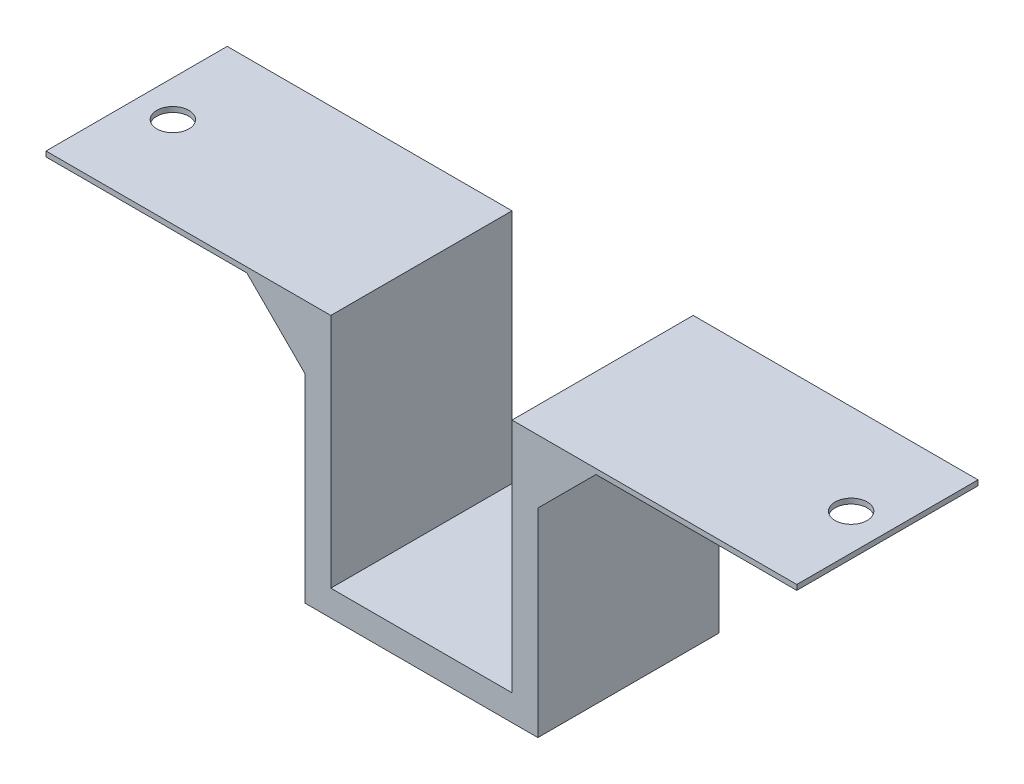
ISO-10303-21;
HEADER;
FILE_DESCRIPTION(('STEP AP214'),'2;1');
FILE_NAME('part.step','',(''),(''),'','','');
FILE_SCHEMA(('AUTOMOTIVE_DESIGN { 1 0 10303 214 1 1 1 1 }'));
ENDSEC;
DATA;
#1=APPLICATION_CONTEXT('core data for automotive mechanical design processes');
#2=APPLICATION_PROTOCOL_DEFINITION('international standard','automotive_design',2000,#1);
#3=PRODUCT_CONTEXT('',#1,'mechanical');
#4=PRODUCT('Part','Part','',(#3));
#5=PRODUCT_RELATED_PRODUCT_CATEGORY('part','',(#4));
#6=PRODUCT_DEFINITION_FORMATION('','',#4);
#7=PRODUCT_DEFINITION_CONTEXT('part definition',#1,'design');
#8=PRODUCT_DEFINITION('design','',#6,#7);
#9=PRODUCT_DEFINITION_SHAPE('','',#8);
#10=(LENGTH_UNIT() NAMED_UNIT(*) SI_UNIT(.MILLI.,.METRE.));
#11=(NAMED_UNIT(*) PLANE_ANGLE_UNIT() SI_UNIT($,.RADIAN.));
#12=(NAMED_UNIT(*) SI_UNIT($,.STERADIAN.) SOLID_ANGLE_UNIT());
#13=UNCERTAINTY_MEASURE_WITH_UNIT(LENGTH_MEASURE(1.E-05),#10,'distance_accuracy_value','');
#14=(GEOMETRIC_REPRESENTATION_CONTEXT(3) GLOBAL_UNCERTAINTY_ASSIGNED_CONTEXT((#13)) GLOBAL_UNIT_ASSIGNED_CONTEXT((#10,
#11,#12)) REPRESENTATION_CONTEXT('',''));
#15=CARTESIAN_POINT('',(0.,0.,0.));
#16=DIRECTION('',(0.,0.,1.));
#17=DIRECTION('',(1.,0.,0.));
#18=AXIS2_PLACEMENT_3D('',#15,#16,#17);
#19=CARTESIAN_POINT('',(-22.225,0.,44.45));
#20=DIRECTION('',(0.,1.,0.));
#21=DIRECTION('',(-1.,0.,0.));
#22=AXIS2_PLACEMENT_3D('',#19,#20,#21);
#23=PLANE('',#22);
#24=DIRECTION('',(1.,0.,0.));
#25=VECTOR('',#24,1.);
#26=CARTESIAN_POINT('',(-22.225,0.,0.));
#27=LINE('',#26,#25);
#28=CARTESIAN_POINT('',(-22.225,0.,0.));
#29=VERTEX_POINT('',#28);
#30=CARTESIAN_POINT('',(22.225,0.,0.));
#31=VERTEX_POINT('',#30);
#32=EDGE_CURVE('E189',#29,#31,#27,.T.);
#33=ORIENTED_EDGE('',*,*,#32,.F.);
#34=DIRECTION('',(0.,0.,-1.));
#35=VECTOR('',#34,1.);
#36=CARTESIAN_POINT('',(-22.225,0.,44.45));
#37=LINE('',#36,#35);
#38=CARTESIAN_POINT('',(-22.225,0.,44.45));
#39=VERTEX_POINT('',#38);
#40=EDGE_CURVE('E11',#39,#29,#37,.T.);
#41=ORIENTED_EDGE('',*,*,#40,.F.);
#42=DIRECTION('',(1.,0.,0.));
#43=VECTOR('',#42,1.);
#44=CARTESIAN_POINT('',(-22.225,0.,44.45));
#45=LINE('',#44,#43);
#46=CARTESIAN_POINT('',(22.225,0.,44.45));
#47=VERTEX_POINT('',#46);
#48=EDGE_CURVE('E239',#39,#47,#45,.T.);
#49=ORIENTED_EDGE('',*,*,#48,.T.);
#50=DIRECTION('',(0.,0.,-1.));
#51=VECTOR('',#50,1.);
#52=CARTESIAN_POINT('',(22.225,0.,44.45));
#53=LINE('',#52,#51);
#54=EDGE_CURVE('E50',#47,#31,#53,.T.);
#55=ORIENTED_EDGE('',*,*,#54,.T.);
#56=EDGE_LOOP('',(#33,#41,#49,#55));
#57=FACE_BOUND('',#56,.T.);
#58=ADVANCED_FACE('F47',(#57),#23,.T.);
#59=CARTESIAN_POINT('',(-22.225,0.,44.45));
#60=DIRECTION('',(-1.,0.,0.));
#61=DIRECTION('',(0.,0.,1.));
#62=AXIS2_PLACEMENT_3D('',#59,#60,#61);
#63=PLANE('',#62);
#64=DIRECTION('',(0.,1.,0.));
#65=VECTOR('',#64,1.);
#66=CARTESIAN_POINT('',(-22.225,0.,0.));
#67=LINE('',#66,#65);
#68=CARTESIAN_POINT('',(-22.225,57.9374,0.));
#69=VERTEX_POINT('',#68);
#70=EDGE_CURVE('E111',#29,#69,#67,.T.);
#71=ORIENTED_EDGE('',*,*,#70,.T.);
#72=DIRECTION('',(0.,0.,-1.));
#73=VECTOR('',#72,1.);
#74=CARTESIAN_POINT('',(-22.225,57.9374,44.45));
#75=LINE('',#74,#73);
#76=CARTESIAN_POINT('',(-22.225,57.9374,44.45));
#77=VERTEX_POINT('',#76);
#78=EDGE_CURVE('E57',#77,#69,#75,.T.);
#79=ORIENTED_EDGE('',*,*,#78,.F.);
#80=DIRECTION('',(0.,1.,0.));
#81=VECTOR('',#80,1.);
#82=CARTESIAN_POINT('',(-22.225,0.,44.45));
#83=LINE('',#82,#81);
#84=EDGE_CURVE('E160',#39,#77,#83,.T.);
#85=ORIENTED_EDGE('',*,*,#84,.F.);
#86=ORIENTED_EDGE('',*,*,#40,.T.);
#87=EDGE_LOOP('',(#71,#79,#85,#86));
#88=FACE_BOUND('',#87,.T.);
#89=ADVANCED_FACE('F390',(#88),#63,.F.);
#90=CARTESIAN_POINT('',(-22.225,57.9374,44.45));
#91=DIRECTION('',(0.,-1.,0.));
#92=DIRECTION('',(1.,0.,0.));
#93=AXIS2_PLACEMENT_3D('',#90,#91,#92);
#94=PLANE('',#93);
#95=CARTESIAN_POINT('',(-83.1849999999999,57.9374,22.225));
#96=DIRECTION('',(0.,-1.,0.));
#97=DIRECTION('',(-1.,0.,0.));
#98=AXIS2_PLACEMENT_3D('',#95,#96,#97);
#99=CIRCLE('',#98,3.937);
#100=CARTESIAN_POINT('',(-87.1219999999999,57.9374,22.225));
#101=VERTEX_POINT('',#100);
#102=EDGE_CURVE('E330',#101,#101,#99,.T.);
#103=ORIENTED_EDGE('',*,*,#102,.T.);
#104=EDGE_LOOP('',(#103));
#105=FACE_BOUND('',#104,.T.);
#106=DIRECTION('',(-1.,0.,0.));
#107=VECTOR('',#106,1.);
#108=CARTESIAN_POINT('',(-22.225,57.9374,0.));
#109=LINE('',#108,#107);
#110=CARTESIAN_POINT('',(-92.075,57.9374,0.));
#111=VERTEX_POINT('',#110);
#112=EDGE_CURVE('E168',#69,#111,#109,.T.);
#113=ORIENTED_EDGE('',*,*,#112,.T.);
#114=DIRECTION('',(0.,0.,-1.));
#115=VECTOR('',#114,1.);
#116=CARTESIAN_POINT('',(-92.075,57.9374,44.45));
#117=LINE('',#116,#115);
#118=CARTESIAN_POINT('',(-92.075,57.9374,44.45));
#119=VERTEX_POINT('',#118);
#120=EDGE_CURVE('E165',#119,#111,#117,.T.);
#121=ORIENTED_EDGE('',*,*,#120,.F.);
#122=DIRECTION('',(-1.,0.,0.));
#123=VECTOR('',#122,1.);
#124=CARTESIAN_POINT('',(-28.575,57.9374,44.45));
#125=LINE('',#124,#123);
#126=EDGE_CURVE('E153',#77,#119,#125,.T.);
#127=ORIENTED_EDGE('',*,*,#126,.F.);
#128=ORIENTED_EDGE('',*,*,#78,.T.);
#129=EDGE_LOOP('',(#113,#121,#127,#128));
#130=FACE_BOUND('',#129,.T.);
#131=ADVANCED_FACE('F166',(#105,#130),#94,.F.);
#132=CARTESIAN_POINT('',(-92.075,57.9374,44.45));
#133=DIRECTION('',(1.,0.,0.));
#134=DIRECTION('',(0.,0.,-1.));
#135=AXIS2_PLACEMENT_3D('',#132,#133,#134);
#136=PLANE('',#135);
#137=DIRECTION('',(0.,-1.,0.));
#138=VECTOR('',#137,1.);
#139=CARTESIAN_POINT('',(-92.075,57.9374,0.));
#140=LINE('',#139,#138);
#141=CARTESIAN_POINT('',(-92.075,56.6674,0.));
#142=VERTEX_POINT('',#141);
#143=EDGE_CURVE('E233',#111,#142,#140,.T.);
#144=ORIENTED_EDGE('',*,*,#143,.T.);
#145=DIRECTION('',(0.,0.,-1.));
#146=VECTOR('',#145,1.);
#147=CARTESIAN_POINT('',(-92.075,56.6674,44.45));
#148=LINE('',#147,#146);
#149=CARTESIAN_POINT('',(-92.075,56.6674,44.45));
#150=VERTEX_POINT('',#149);
#151=EDGE_CURVE('E172',#150,#142,#148,.T.);
#152=ORIENTED_EDGE('',*,*,#151,.F.);
#153=DIRECTION('',(0.,-1.,0.));
#154=VECTOR('',#153,1.);
#155=CARTESIAN_POINT('',(-92.075,57.9374,44.45));
#156=LINE('',#155,#154);
#157=EDGE_CURVE('E158',#119,#150,#156,.T.);
#158=ORIENTED_EDGE('',*,*,#157,.F.);
#159=ORIENTED_EDGE('',*,*,#120,.T.);
#160=EDGE_LOOP('',(#144,#152,#158,#159));
#161=FACE_BOUND('',#160,.T.);
#162=ADVANCED_FACE('F174',(#161),#136,.F.);
#163=CARTESIAN_POINT('',(-92.075,56.6674,44.45));
#164=DIRECTION('',(0.,1.,0.));
#165=DIRECTION('',(0.,0.,1.));
#166=AXIS2_PLACEMENT_3D('',#163,#164,#165);
#167=PLANE('',#166);
#168=CARTESIAN_POINT('',(-83.1849999999999,56.6674000000001,22.225));
#169=DIRECTION('',(0.,-1.,0.));
#170=DIRECTION('',(-1.,0.,0.));
#171=AXIS2_PLACEMENT_3D('',#168,#169,#170);
#172=CIRCLE('',#171,3.937);
#173=CARTESIAN_POINT('',(-87.1219999999999,56.6674000000001,22.225));
#174=VERTEX_POINT('',#173);
#175=EDGE_CURVE('E334',#174,#174,#172,.T.);
#176=ORIENTED_EDGE('',*,*,#175,.F.);
#177=EDGE_LOOP('',(#176));
#178=FACE_BOUND('',#177,.T.);
#179=DIRECTION('',(1.,0.,0.));
#180=VECTOR('',#179,1.);
#181=CARTESIAN_POINT('',(-92.075,56.6674,0.));
#182=LINE('',#181,#180);
#183=CARTESIAN_POINT('',(-42.8181414649475,56.6674,0.));
#184=VERTEX_POINT('',#183);
#185=EDGE_CURVE('E230',#142,#184,#182,.T.);
#186=ORIENTED_EDGE('',*,*,#185,.T.);
#187=DIRECTION('',(0.,0.,-1.));
#188=VECTOR('',#187,1.);
#189=CARTESIAN_POINT('',(-42.8181414649475,56.6674,44.45));
#190=LINE('',#189,#188);
#191=CARTESIAN_POINT('',(-42.8181414649475,56.6674,44.45));
#192=VERTEX_POINT('',#191);
#193=EDGE_CURVE('E245',#192,#184,#190,.T.);
#194=ORIENTED_EDGE('',*,*,#193,.F.);
#195=DIRECTION('',(1.,0.,0.));
#196=VECTOR('',#195,1.);
#197=CARTESIAN_POINT('',(-92.075,56.6674,44.45));
#198=LINE('',#197,#196);
#199=EDGE_CURVE('E178',#150,#192,#198,.T.);
#200=ORIENTED_EDGE('',*,*,#199,.F.);
#201=ORIENTED_EDGE('',*,*,#151,.T.);
#202=EDGE_LOOP('',(#186,#194,#200,#201));
#203=FACE_BOUND('',#202,.T.);
#204=ADVANCED_FACE('F283',(#178,#203),#167,.F.);
#205=CARTESIAN_POINT('',(-42.8181414649475,56.6674,44.45));
#206=DIRECTION('',(0.707106781186539,0.707106781186556,0.));
#207=DIRECTION('',(-0.707106781186556,0.707106781186539,0.));
#208=AXIS2_PLACEMENT_3D('',#205,#206,#207);
#209=PLANE('',#208);
#210=DIRECTION('',(0.707106781186556,-0.707106781186539,0.));
#211=VECTOR('',#210,1.);
#212=CARTESIAN_POINT('',(-42.8181414649475,56.6674,0.));
#213=LINE('',#212,#211);
#214=CARTESIAN_POINT('',(-28.575,42.4242585350528,0.));
#215=VERTEX_POINT('',#214);
#216=EDGE_CURVE('E226',#184,#215,#213,.T.);
#217=ORIENTED_EDGE('',*,*,#216,.T.);
#218=DIRECTION('',(0.,0.,-1.));
#219=VECTOR('',#218,1.);
#220=CARTESIAN_POINT('',(-28.575,42.4242585350528,44.45));
#221=LINE('',#220,#219);
#222=CARTESIAN_POINT('',(-28.575,42.4242585350528,44.45));
#223=VERTEX_POINT('',#222);
#224=EDGE_CURVE('E249',#223,#215,#221,.T.);
#225=ORIENTED_EDGE('',*,*,#224,.F.);
#226=DIRECTION('',(0.707106781186556,-0.707106781186539,0.));
#227=VECTOR('',#226,1.);
#228=CARTESIAN_POINT('',(-42.8181414649475,56.6674,44.45));
#229=LINE('',#228,#227);
#230=EDGE_CURVE('E183',#192,#223,#229,.T.);
#231=ORIENTED_EDGE('',*,*,#230,.F.);
#232=ORIENTED_EDGE('',*,*,#193,.T.);
#233=EDGE_LOOP('',(#217,#225,#231,#232));
#234=FACE_BOUND('',#233,.T.);
#235=ADVANCED_FACE('F294',(#234),#209,.F.);
#236=CARTESIAN_POINT('',(-28.575,-6.35000000000001,44.45));
#237=DIRECTION('',(-1.,0.,0.));
#238=DIRECTION('',(0.,-1.,0.));
#239=AXIS2_PLACEMENT_3D('',#236,#237,#238);
#240=PLANE('',#239);
#241=DIRECTION('',(0.,1.,0.));
#242=VECTOR('',#241,1.);
#243=CARTESIAN_POINT('',(-28.575,-6.35000000000001,0.));
#244=LINE('',#243,#242);
#245=CARTESIAN_POINT('',(-28.575,-6.35000000000001,0.));
#246=VERTEX_POINT('',#245);
#247=EDGE_CURVE('E222',#246,#215,#244,.T.);
#248=ORIENTED_EDGE('',*,*,#247,.F.);
#249=DIRECTION('',(0.,0.,-1.));
#250=VECTOR('',#249,1.);
#251=CARTESIAN_POINT('',(-28.575,-6.35000000000001,44.45));
#252=LINE('',#251,#250);
#253=CARTESIAN_POINT('',(-28.575,-6.35000000000001,44.45));
#254=VERTEX_POINT('',#253);
#255=EDGE_CURVE('E252',#254,#246,#252,.T.);
#256=ORIENTED_EDGE('',*,*,#255,.F.);
#257=DIRECTION('',(0.,1.,0.));
#258=VECTOR('',#257,1.);
#259=CARTESIAN_POINT('',(-28.575,-6.35000000000001,44.45));
#260=LINE('',#259,#258);
#261=EDGE_CURVE('E290',#254,#223,#260,.T.);
#262=ORIENTED_EDGE('',*,*,#261,.T.);
#263=ORIENTED_EDGE('',*,*,#224,.T.);
#264=EDGE_LOOP('',(#248,#256,#262,#263));
#265=FACE_BOUND('',#264,.T.);
#266=ADVANCED_FACE('F297',(#265),#240,.T.);
#267=CARTESIAN_POINT('',(28.575,-6.35,44.45));
#268=DIRECTION('',(0.,-1.,0.));
#269=DIRECTION('',(1.,0.,0.));
#270=AXIS2_PLACEMENT_3D('',#267,#268,#269);
#271=PLANE('',#270);
#272=DIRECTION('',(-1.,0.,0.));
#273=VECTOR('',#272,1.);
#274=CARTESIAN_POINT('',(28.575,-6.35,0.));
#275=LINE('',#274,#273);
#276=CARTESIAN_POINT('',(28.575,-6.35,0.));
#277=VERTEX_POINT('',#276);
#278=EDGE_CURVE('E218',#277,#246,#275,.T.);
#279=ORIENTED_EDGE('',*,*,#278,.F.);
#280=DIRECTION('',(0.,0.,-1.));
#281=VECTOR('',#280,1.);
#282=CARTESIAN_POINT('',(28.575,-6.35,44.45));
#283=LINE('',#282,#281);
#284=CARTESIAN_POINT('',(28.575,-6.35,44.45));
#285=VERTEX_POINT('',#284);
#286=EDGE_CURVE('E255',#285,#277,#283,.T.);
#287=ORIENTED_EDGE('',*,*,#286,.F.);
#288=DIRECTION('',(-1.,0.,0.));
#289=VECTOR('',#288,1.);
#290=CARTESIAN_POINT('',(28.575,-6.35,44.45));
#291=LINE('',#290,#289);
#292=EDGE_CURVE('E299',#285,#254,#291,.T.);
#293=ORIENTED_EDGE('',*,*,#292,.T.);
#294=ORIENTED_EDGE('',*,*,#255,.T.);
#295=EDGE_LOOP('',(#279,#287,#293,#294));
#296=FACE_BOUND('',#295,.T.);
#297=ADVANCED_FACE('F380',(#296),#271,.T.);
#298=CARTESIAN_POINT('',(28.5749999999999,42.4242585350529,44.45));
#299=DIRECTION('',(1.,0.,0.));
#300=DIRECTION('',(0.,1.,0.));
#301=AXIS2_PLACEMENT_3D('',#298,#299,#300);
#302=PLANE('',#301);
#303=DIRECTION('',(0.,-1.,0.));
#304=VECTOR('',#303,1.);
#305=CARTESIAN_POINT('',(28.5749999999999,42.4242585350529,0.));
#306=LINE('',#305,#304);
#307=CARTESIAN_POINT('',(28.5749999999999,42.4242585350529,0.));
#308=VERTEX_POINT('',#307);
#309=EDGE_CURVE('E214',#308,#277,#306,.T.);
#310=ORIENTED_EDGE('',*,*,#309,.F.);
#311=DIRECTION('',(0.,0.,-1.));
#312=VECTOR('',#311,1.);
#313=CARTESIAN_POINT('',(28.5749999999999,42.4242585350529,44.45));
#314=LINE('',#313,#312);
#315=CARTESIAN_POINT('',(28.5749999999999,42.4242585350529,44.45));
#316=VERTEX_POINT('',#315);
#317=EDGE_CURVE('E258',#316,#308,#314,.T.);
#318=ORIENTED_EDGE('',*,*,#317,.F.);
#319=DIRECTION('',(0.,-1.,0.));
#320=VECTOR('',#319,1.);
#321=CARTESIAN_POINT('',(28.5749999999999,42.4242585350529,44.45));
#322=LINE('',#321,#320);
#323=EDGE_CURVE('E304',#316,#285,#322,.T.);
#324=ORIENTED_EDGE('',*,*,#323,.T.);
#325=ORIENTED_EDGE('',*,*,#286,.T.);
#326=EDGE_LOOP('',(#310,#318,#324,#325));
#327=FACE_BOUND('',#326,.T.);
#328=ADVANCED_FACE('F378',(#327),#302,.T.);
#329=CARTESIAN_POINT('',(42.8181414649474,56.6674000000001,44.45));
#330=DIRECTION('',(0.707106781186541,-0.707106781186554,0.));
#331=DIRECTION('',(0.707106781186554,0.707106781186541,0.));
#332=AXIS2_PLACEMENT_3D('',#329,#330,#331);
#333=PLANE('',#332);
#334=DIRECTION('',(-0.707106781186554,-0.707106781186541,0.));
#335=VECTOR('',#334,1.);
#336=CARTESIAN_POINT('',(42.8181414649474,56.6674000000001,0.));
#337=LINE('',#336,#335);
#338=CARTESIAN_POINT('',(42.8181414649474,56.6674000000001,0.));
#339=VERTEX_POINT('',#338);
#340=EDGE_CURVE('E210',#339,#308,#337,.T.);
#341=ORIENTED_EDGE('',*,*,#340,.F.);
#342=DIRECTION('',(0.,0.,-1.));
#343=VECTOR('',#342,1.);
#344=CARTESIAN_POINT('',(42.8181414649474,56.6674000000001,44.45));
#345=LINE('',#344,#343);
#346=CARTESIAN_POINT('',(42.8181414649474,56.6674000000001,44.45));
#347=VERTEX_POINT('',#346);
#348=EDGE_CURVE('E261',#347,#339,#345,.T.);
#349=ORIENTED_EDGE('',*,*,#348,.F.);
#350=DIRECTION('',(-0.707106781186554,-0.707106781186541,0.));
#351=VECTOR('',#350,1.);
#352=CARTESIAN_POINT('',(42.8181414649474,56.6674000000001,44.45));
#353=LINE('',#352,#351);
#354=EDGE_CURVE('E310',#347,#316,#353,.T.);
#355=ORIENTED_EDGE('',*,*,#354,.T.);
#356=ORIENTED_EDGE('',*,*,#317,.T.);
#357=EDGE_LOOP('',(#341,#349,#355,#356));
#358=FACE_BOUND('',#357,.T.);
#359=ADVANCED_FACE('F362',(#358),#333,.T.);
#360=CARTESIAN_POINT('',(92.075,56.6674,44.45));
#361=DIRECTION('',(0.,-1.,0.));
#362=DIRECTION('',(1.,0.,0.));
#363=AXIS2_PLACEMENT_3D('',#360,#361,#362);
#364=PLANE('',#363);
#365=CARTESIAN_POINT('',(83.1850000000001,56.6674000000002,22.225));
#366=DIRECTION('',(0.,-1.,0.));
#367=DIRECTION('',(1.,0.,0.));
#368=AXIS2_PLACEMENT_3D('',#365,#366,#367);
#369=CIRCLE('',#368,3.937);
#370=CARTESIAN_POINT('',(87.1220000000001,56.6674000000002,22.225));
#371=VERTEX_POINT('',#370);
#372=EDGE_CURVE('E338',#371,#371,#369,.T.);
#373=ORIENTED_EDGE('',*,*,#372,.F.);
#374=EDGE_LOOP('',(#373));
#375=FACE_BOUND('',#374,.T.);
#376=DIRECTION('',(-1.,0.,0.));
#377=VECTOR('',#376,1.);
#378=CARTESIAN_POINT('',(92.075,56.6674,0.));
#379=LINE('',#378,#377);
#380=CARTESIAN_POINT('',(92.075,56.6674,0.));
#381=VERTEX_POINT('',#380);
#382=EDGE_CURVE('E206',#381,#339,#379,.T.);
#383=ORIENTED_EDGE('',*,*,#382,.F.);
#384=DIRECTION('',(0.,0.,-1.));
#385=VECTOR('',#384,1.);
#386=CARTESIAN_POINT('',(92.075,56.6674,44.45));
#387=LINE('',#386,#385);
#388=CARTESIAN_POINT('',(92.075,56.6674,44.45));
#389=VERTEX_POINT('',#388);
#390=EDGE_CURVE('E264',#389,#381,#387,.T.);
#391=ORIENTED_EDGE('',*,*,#390,.F.);
#392=DIRECTION('',(-1.,0.,0.));
#393=VECTOR('',#392,1.);
#394=CARTESIAN_POINT('',(92.075,56.6674,44.45));
#395=LINE('',#394,#393);
#396=EDGE_CURVE('E314',#389,#347,#395,.T.);
#397=ORIENTED_EDGE('',*,*,#396,.T.);
#398=ORIENTED_EDGE('',*,*,#348,.T.);
#399=EDGE_LOOP('',(#383,#391,#397,#398));
#400=FACE_BOUND('',#399,.T.);
#401=ADVANCED_FACE('F358',(#375,#400),#364,.T.);
#402=CARTESIAN_POINT('',(92.075,57.9374,44.45));
#403=DIRECTION('',(1.,0.,0.));
#404=DIRECTION('',(0.,0.,-1.));
#405=AXIS2_PLACEMENT_3D('',#402,#403,#404);
#406=PLANE('',#405);
#407=DIRECTION('',(0.,-1.,0.));
#408=VECTOR('',#407,1.);
#409=CARTESIAN_POINT('',(92.075,57.9374,0.));
#410=LINE('',#409,#408);
#411=CARTESIAN_POINT('',(92.075,57.9374,0.));
#412=VERTEX_POINT('',#411);
#413=EDGE_CURVE('E202',#412,#381,#410,.T.);
#414=ORIENTED_EDGE('',*,*,#413,.F.);
#415=DIRECTION('',(0.,0.,-1.));
#416=VECTOR('',#415,1.);
#417=CARTESIAN_POINT('',(92.075,57.9374,44.45));
#418=LINE('',#417,#416);
#419=CARTESIAN_POINT('',(92.075,57.9374,44.45));
#420=VERTEX_POINT('',#419);
#421=EDGE_CURVE('E267',#420,#412,#418,.T.);
#422=ORIENTED_EDGE('',*,*,#421,.F.);
#423=DIRECTION('',(0.,-1.,0.));
#424=VECTOR('',#423,1.);
#425=CARTESIAN_POINT('',(92.075,57.9374,44.45));
#426=LINE('',#425,#424);
#427=EDGE_CURVE('E318',#420,#389,#426,.T.);
#428=ORIENTED_EDGE('',*,*,#427,.T.);
#429=ORIENTED_EDGE('',*,*,#390,.T.);
#430=EDGE_LOOP('',(#414,#422,#428,#429));
#431=FACE_BOUND('',#430,.T.);
#432=ADVANCED_FACE('F361',(#431),#406,.T.);
#433=CARTESIAN_POINT('',(28.575,57.9374,44.45));
#434=DIRECTION('',(0.,1.,0.));
#435=DIRECTION('',(-1.,0.,0.));
#436=AXIS2_PLACEMENT_3D('',#433,#434,#435);
#437=PLANE('',#436);
#438=CARTESIAN_POINT('',(83.1850000000001,57.9374000000001,22.225));
#439=DIRECTION('',(0.,-1.,0.));
#440=DIRECTION('',(1.,0.,0.));
#441=AXIS2_PLACEMENT_3D('',#438,#439,#440);
#442=CIRCLE('',#441,3.937);
#443=CARTESIAN_POINT('',(87.1220000000001,57.9374000000001,22.225));
#444=VERTEX_POINT('',#443);
#445=EDGE_CURVE('E194',#444,#444,#442,.T.);
#446=ORIENTED_EDGE('',*,*,#445,.T.);
#447=EDGE_LOOP('',(#446));
#448=FACE_BOUND('',#447,.T.);
#449=DIRECTION('',(1.,0.,0.));
#450=VECTOR('',#449,1.);
#451=CARTESIAN_POINT('',(28.575,57.9374,0.));
#452=LINE('',#451,#450);
#453=CARTESIAN_POINT('',(22.225,57.9374,0.));
#454=VERTEX_POINT('',#453);
#455=EDGE_CURVE('E198',#454,#412,#452,.T.);
#456=ORIENTED_EDGE('',*,*,#455,.F.);
#457=DIRECTION('',(0.,0.,-1.));
#458=VECTOR('',#457,1.);
#459=CARTESIAN_POINT('',(22.225,57.9374,44.45));
#460=LINE('',#459,#458);
#461=CARTESIAN_POINT('',(22.225,57.9374,44.45));
#462=VERTEX_POINT('',#461);
#463=EDGE_CURVE('E269',#462,#454,#460,.T.);
#464=ORIENTED_EDGE('',*,*,#463,.F.);
#465=DIRECTION('',(1.,0.,0.));
#466=VECTOR('',#465,1.);
#467=CARTESIAN_POINT('',(22.225,57.9374,44.45));
#468=LINE('',#467,#466);
#469=EDGE_CURVE('E322',#462,#420,#468,.T.);
#470=ORIENTED_EDGE('',*,*,#469,.T.);
#471=ORIENTED_EDGE('',*,*,#421,.T.);
#472=EDGE_LOOP('',(#456,#464,#470,#471));
#473=FACE_BOUND('',#472,.T.);
#474=ADVANCED_FACE('F348',(#448,#473),#437,.T.);
#475=CARTESIAN_POINT('',(22.225,0.,44.45));
#476=DIRECTION('',(-1.,0.,0.));
#477=DIRECTION('',(0.,-1.,0.));
#478=AXIS2_PLACEMENT_3D('',#475,#476,#477);
#479=PLANE('',#478);
#480=DIRECTION('',(0.,1.,0.));
#481=VECTOR('',#480,1.);
#482=CARTESIAN_POINT('',(22.225,0.,0.));
#483=LINE('',#482,#481);
#484=EDGE_CURVE('E193',#31,#454,#483,.T.);
#485=ORIENTED_EDGE('',*,*,#484,.F.);
#486=ORIENTED_EDGE('',*,*,#54,.F.);
#487=DIRECTION('',(0.,1.,0.));
#488=VECTOR('',#487,1.);
#489=CARTESIAN_POINT('',(22.225,0.,44.45));
#490=LINE('',#489,#488);
#491=EDGE_CURVE('E325',#47,#462,#490,.T.);
#492=ORIENTED_EDGE('',*,*,#491,.T.);
#493=ORIENTED_EDGE('',*,*,#463,.T.);
#494=EDGE_LOOP('',(#485,#486,#492,#493));
#495=FACE_BOUND('',#494,.T.);
#496=ADVANCED_FACE('F277',(#495),#479,.T.);
#497=CARTESIAN_POINT('',(0.,0.,44.45));
#498=DIRECTION('',(0.,0.,1.));
#499=DIRECTION('',(1.,0.,0.));
#500=AXIS2_PLACEMENT_3D('',#497,#498,#499);
#501=PLANE('',#500);
#502=ORIENTED_EDGE('',*,*,#48,.F.);
#503=ORIENTED_EDGE('',*,*,#84,.T.);
#504=ORIENTED_EDGE('',*,*,#126,.T.);
#505=ORIENTED_EDGE('',*,*,#157,.T.);
#506=ORIENTED_EDGE('',*,*,#199,.T.);
#507=ORIENTED_EDGE('',*,*,#230,.T.);
#508=ORIENTED_EDGE('',*,*,#261,.F.);
#509=ORIENTED_EDGE('',*,*,#292,.F.);
#510=ORIENTED_EDGE('',*,*,#323,.F.);
#511=ORIENTED_EDGE('',*,*,#354,.F.);
#512=ORIENTED_EDGE('',*,*,#396,.F.);
#513=ORIENTED_EDGE('',*,*,#427,.F.);
#514=ORIENTED_EDGE('',*,*,#469,.F.);
#515=ORIENTED_EDGE('',*,*,#491,.F.);
#516=EDGE_LOOP('',(#502,#503,#504,#505,#506,#507,#508,#509,#510,#511,#512,#513,#514,#515));
#517=FACE_BOUND('',#516,.T.);
#518=ADVANCED_FACE('F156',(#517),#501,.T.);
#519=CARTESIAN_POINT('',(0.,0.,0.));
#520=DIRECTION('',(0.,0.,1.));
#521=DIRECTION('',(1.,0.,0.));
#522=AXIS2_PLACEMENT_3D('',#519,#520,#521);
#523=PLANE('',#522);
#524=ORIENTED_EDGE('',*,*,#32,.T.);
#525=ORIENTED_EDGE('',*,*,#484,.T.);
#526=ORIENTED_EDGE('',*,*,#455,.T.);
#527=ORIENTED_EDGE('',*,*,#413,.T.);
#528=ORIENTED_EDGE('',*,*,#382,.T.);
#529=ORIENTED_EDGE('',*,*,#340,.T.);
#530=ORIENTED_EDGE('',*,*,#309,.T.);
#531=ORIENTED_EDGE('',*,*,#278,.T.);
#532=ORIENTED_EDGE('',*,*,#247,.T.);
#533=ORIENTED_EDGE('',*,*,#216,.F.);
#534=ORIENTED_EDGE('',*,*,#185,.F.);
#535=ORIENTED_EDGE('',*,*,#143,.F.);
#536=ORIENTED_EDGE('',*,*,#112,.F.);
#537=ORIENTED_EDGE('',*,*,#70,.F.);
#538=EDGE_LOOP('',(#524,#525,#526,#527,#528,#529,#530,#531,#532,#533,#534,#535,#536,#537));
#539=FACE_BOUND('',#538,.T.);
#540=ADVANCED_FACE('F279',(#539),#523,.F.);
#541=CARTESIAN_POINT('',(83.1850000000001,57.9374000000001,22.225));
#542=DIRECTION('',(0.,-1.,0.));
#543=DIRECTION('',(1.,0.,0.));
#544=AXIS2_PLACEMENT_3D('',#541,#542,#543);
#545=CYLINDRICAL_SURFACE('',#544,3.937);
#546=ORIENTED_EDGE('',*,*,#445,.F.);
#547=EDGE_LOOP('',(#546));
#548=FACE_BOUND('',#547,.T.);
#549=ORIENTED_EDGE('',*,*,#372,.T.);
#550=EDGE_LOOP('',(#549));
#551=FACE_BOUND('',#550,.T.);
#552=ADVANCED_FACE('F351',(#548,#551),#545,.F.);
#553=CARTESIAN_POINT('',(-83.1849999999999,57.9374,22.225));
#554=DIRECTION('',(0.,-1.,0.));
#555=DIRECTION('',(1.,0.,0.));
#556=AXIS2_PLACEMENT_3D('',#553,#554,#555);
#557=CYLINDRICAL_SURFACE('',#556,3.937);
#558=ORIENTED_EDGE('',*,*,#102,.F.);
#559=EDGE_LOOP('',(#558));
#560=FACE_BOUND('',#559,.T.);
#561=ORIENTED_EDGE('',*,*,#175,.T.);
#562=EDGE_LOOP('',(#561));
#563=FACE_BOUND('',#562,.T.);
#564=ADVANCED_FACE('F354',(#560,#563),#557,.F.);
#565=CLOSED_SHELL('',(#58,#89,#131,#162,#204,#235,#266,#297,#328,#359,#401,#432,#474,#496,#518,
#540,#552,#564));
#566=MANIFOLD_SOLID_BREP('B2',#565);
#567=ADVANCED_BREP_SHAPE_REPRESENTATION('',(#18,#566),#14);
#568=SHAPE_DEFINITION_REPRESENTATION(#9,#567);
ENDSEC;
END-ISO-10303-21;
